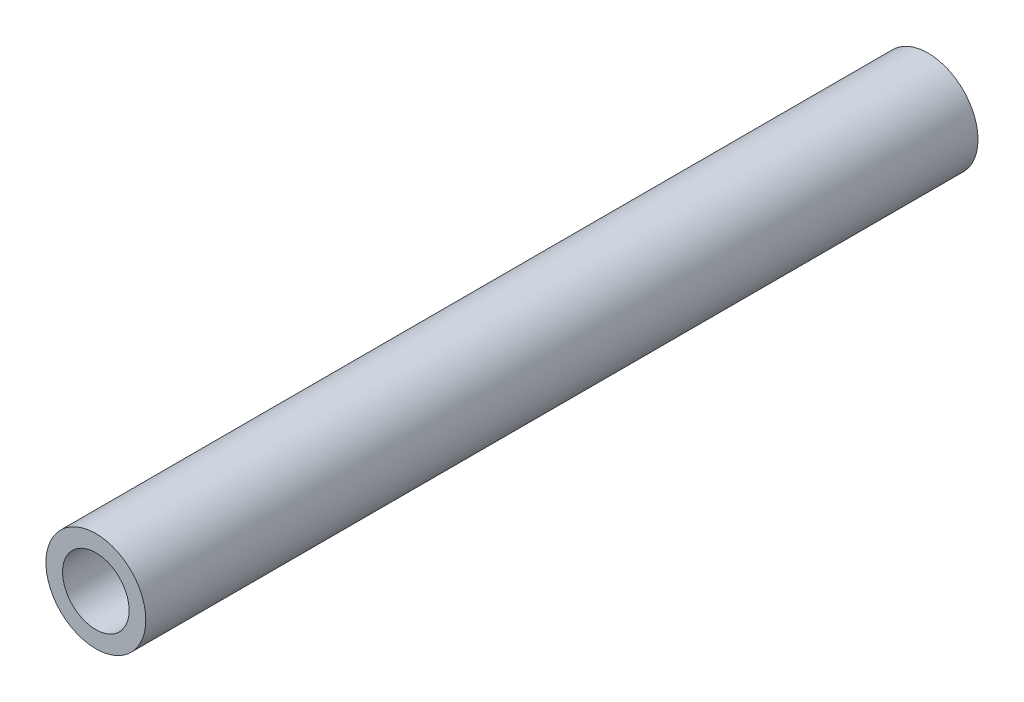
ISO-10303-21;
HEADER;
FILE_DESCRIPTION(('STEP AP214'),'2;1');
FILE_NAME('part.step','',(''),(''),'','','');
FILE_SCHEMA(('AUTOMOTIVE_DESIGN { 1 0 10303 214 1 1 1 1 }'));
ENDSEC;
DATA;
#1=APPLICATION_CONTEXT('core data for automotive mechanical design processes');
#2=APPLICATION_PROTOCOL_DEFINITION('international standard','automotive_design',2000,#1);
#3=PRODUCT_CONTEXT('',#1,'mechanical');
#4=PRODUCT('Part','Part','',(#3));
#5=PRODUCT_RELATED_PRODUCT_CATEGORY('part','',(#4));
#6=PRODUCT_DEFINITION_FORMATION('','',#4);
#7=PRODUCT_DEFINITION_CONTEXT('part definition',#1,'design');
#8=PRODUCT_DEFINITION('design','',#6,#7);
#9=PRODUCT_DEFINITION_SHAPE('','',#8);
#10=(LENGTH_UNIT() NAMED_UNIT(*) SI_UNIT(.MILLI.,.METRE.));
#11=(NAMED_UNIT(*) PLANE_ANGLE_UNIT() SI_UNIT($,.RADIAN.));
#12=(NAMED_UNIT(*) SI_UNIT($,.STERADIAN.) SOLID_ANGLE_UNIT());
#13=UNCERTAINTY_MEASURE_WITH_UNIT(LENGTH_MEASURE(1.E-05),#10,'distance_accuracy_value','');
#14=(GEOMETRIC_REPRESENTATION_CONTEXT(3) GLOBAL_UNCERTAINTY_ASSIGNED_CONTEXT((#13)) GLOBAL_UNIT_ASSIGNED_CONTEXT((#10,
#11,#12)) REPRESENTATION_CONTEXT('',''));
#15=CARTESIAN_POINT('',(0.,0.,0.));
#16=DIRECTION('',(0.,0.,1.));
#17=DIRECTION('',(1.,0.,0.));
#18=AXIS2_PLACEMENT_3D('',#15,#16,#17);
#19=CARTESIAN_POINT('',(0.,0.,50.));
#20=DIRECTION('',(0.,0.,-1.));
#21=DIRECTION('',(-1.,0.,0.));
#22=AXIS2_PLACEMENT_3D('',#19,#20,#21);
#23=CYLINDRICAL_SURFACE('',#22,3.);
#24=CARTESIAN_POINT('',(0.,0.,50.));
#25=DIRECTION('',(0.,0.,1.));
#26=DIRECTION('',(1.,0.,0.));
#27=AXIS2_PLACEMENT_3D('',#24,#25,#26);
#28=CIRCLE('',#27,3.);
#29=CARTESIAN_POINT('',(3.,0.,50.));
#30=VERTEX_POINT('',#29);
#31=EDGE_CURVE('E10',#30,#30,#28,.T.);
#32=ORIENTED_EDGE('',*,*,#31,.F.);
#33=EDGE_LOOP('',(#32));
#34=FACE_BOUND('',#33,.T.);
#35=CARTESIAN_POINT('',(0.,0.,0.));
#36=DIRECTION('',(0.,0.,1.));
#37=DIRECTION('',(1.,0.,0.));
#38=AXIS2_PLACEMENT_3D('',#35,#36,#37);
#39=CIRCLE('',#38,3.);
#40=CARTESIAN_POINT('',(3.,0.,0.));
#41=VERTEX_POINT('',#40);
#42=EDGE_CURVE('E34',#41,#41,#39,.T.);
#43=ORIENTED_EDGE('',*,*,#42,.T.);
#44=EDGE_LOOP('',(#43));
#45=FACE_BOUND('',#44,.T.);
#46=ADVANCED_FACE('F31',(#34,#45),#23,.T.);
#47=CARTESIAN_POINT('',(0.,0.,50.));
#48=DIRECTION('',(0.,0.,1.));
#49=DIRECTION('',(1.,0.,0.));
#50=AXIS2_PLACEMENT_3D('',#47,#48,#49);
#51=PLANE('',#50);
#52=CARTESIAN_POINT('',(0.,0.,50.));
#53=DIRECTION('',(0.,0.,-1.));
#54=DIRECTION('',(-1.,0.,0.));
#55=AXIS2_PLACEMENT_3D('',#52,#53,#54);
#56=CIRCLE('',#55,2.);
#57=CARTESIAN_POINT('',(-2.,0.,50.));
#58=VERTEX_POINT('',#57);
#59=EDGE_CURVE('E41',#58,#58,#56,.T.);
#60=ORIENTED_EDGE('',*,*,#59,.T.);
#61=EDGE_LOOP('',(#60));
#62=FACE_BOUND('',#61,.T.);
#63=ORIENTED_EDGE('',*,*,#31,.T.);
#64=EDGE_LOOP('',(#63));
#65=FACE_BOUND('',#64,.T.);
#66=ADVANCED_FACE('F49',(#62,#65),#51,.T.);
#67=CARTESIAN_POINT('',(0.,0.,0.));
#68=DIRECTION('',(0.,0.,1.));
#69=DIRECTION('',(1.,0.,0.));
#70=AXIS2_PLACEMENT_3D('',#67,#68,#69);
#71=PLANE('',#70);
#72=CARTESIAN_POINT('',(0.,0.,0.));
#73=DIRECTION('',(0.,0.,-1.));
#74=DIRECTION('',(-1.,0.,0.));
#75=AXIS2_PLACEMENT_3D('',#72,#73,#74);
#76=CIRCLE('',#75,2.);
#77=CARTESIAN_POINT('',(-2.,0.,0.));
#78=VERTEX_POINT('',#77);
#79=EDGE_CURVE('E43',#78,#78,#76,.T.);
#80=ORIENTED_EDGE('',*,*,#79,.F.);
#81=EDGE_LOOP('',(#80));
#82=FACE_BOUND('',#81,.T.);
#83=ORIENTED_EDGE('',*,*,#42,.F.);
#84=EDGE_LOOP('',(#83));
#85=FACE_BOUND('',#84,.T.);
#86=ADVANCED_FACE('F54',(#82,#85),#71,.F.);
#87=CARTESIAN_POINT('',(0.,0.,50.));
#88=DIRECTION('',(0.,0.,-1.));
#89=DIRECTION('',(-1.,0.,0.));
#90=AXIS2_PLACEMENT_3D('',#87,#88,#89);
#91=CYLINDRICAL_SURFACE('',#90,2.);
#92=ORIENTED_EDGE('',*,*,#59,.F.);
#93=EDGE_LOOP('',(#92));
#94=FACE_BOUND('',#93,.T.);
#95=ORIENTED_EDGE('',*,*,#79,.T.);
#96=EDGE_LOOP('',(#95));
#97=FACE_BOUND('',#96,.T.);
#98=ADVANCED_FACE('F51',(#94,#97),#91,.F.);
#99=CLOSED_SHELL('',(#46,#66,#86,#98));
#100=MANIFOLD_SOLID_BREP('B2',#99);
#101=ADVANCED_BREP_SHAPE_REPRESENTATION('',(#18,#100),#14);
#102=SHAPE_DEFINITION_REPRESENTATION(#9,#101);
ENDSEC;
END-ISO-10303-21;
